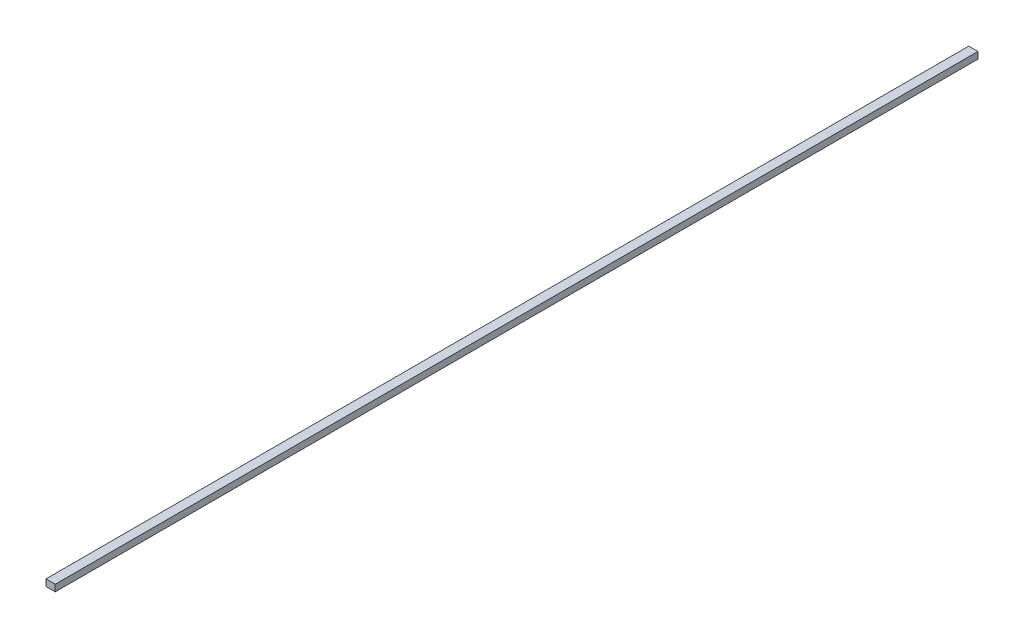
ISO-10303-21;
HEADER;
FILE_DESCRIPTION(('STEP AP214'),'2;1');
FILE_NAME('part.step','',(''),(''),'','','');
FILE_SCHEMA(('AUTOMOTIVE_DESIGN { 1 0 10303 214 1 1 1 1 }'));
ENDSEC;
DATA;
#1=APPLICATION_CONTEXT('core data for automotive mechanical design processes');
#2=APPLICATION_PROTOCOL_DEFINITION('international standard','automotive_design',2000,#1);
#3=PRODUCT_CONTEXT('',#1,'mechanical');
#4=PRODUCT('Part','Part','',(#3));
#5=PRODUCT_RELATED_PRODUCT_CATEGORY('part','',(#4));
#6=PRODUCT_DEFINITION_FORMATION('','',#4);
#7=PRODUCT_DEFINITION_CONTEXT('part definition',#1,'design');
#8=PRODUCT_DEFINITION('design','',#6,#7);
#9=PRODUCT_DEFINITION_SHAPE('','',#8);
#10=(LENGTH_UNIT() NAMED_UNIT(*) SI_UNIT(.MILLI.,.METRE.));
#11=(NAMED_UNIT(*) PLANE_ANGLE_UNIT() SI_UNIT($,.RADIAN.));
#12=(NAMED_UNIT(*) SI_UNIT($,.STERADIAN.) SOLID_ANGLE_UNIT());
#13=UNCERTAINTY_MEASURE_WITH_UNIT(LENGTH_MEASURE(1.E-05),#10,'distance_accuracy_value','');
#14=(GEOMETRIC_REPRESENTATION_CONTEXT(3) GLOBAL_UNCERTAINTY_ASSIGNED_CONTEXT((#13)) GLOBAL_UNIT_ASSIGNED_CONTEXT((#10,
#11,#12)) REPRESENTATION_CONTEXT('',''));
#15=CARTESIAN_POINT('',(0.,0.,0.));
#16=DIRECTION('',(0.,0.,1.));
#17=DIRECTION('',(1.,0.,0.));
#18=AXIS2_PLACEMENT_3D('',#15,#16,#17);
#19=CARTESIAN_POINT('',(0.,0.,500.));
#20=DIRECTION('',(1.,0.,0.));
#21=DIRECTION('',(0.,0.,-1.));
#22=AXIS2_PLACEMENT_3D('',#19,#20,#21);
#23=PLANE('',#22);
#24=DIRECTION('',(0.,-1.,0.));
#25=VECTOR('',#24,1.);
#26=CARTESIAN_POINT('',(0.,0.,0.));
#27=LINE('',#26,#25);
#28=CARTESIAN_POINT('',(0.,3.6,0.));
#29=VERTEX_POINT('',#28);
#30=CARTESIAN_POINT('',(0.,0.,0.));
#31=VERTEX_POINT('',#30);
#32=EDGE_CURVE('E98',#29,#31,#27,.T.);
#33=ORIENTED_EDGE('',*,*,#32,.T.);
#34=DIRECTION('',(0.,0.,-1.));
#35=VECTOR('',#34,1.);
#36=CARTESIAN_POINT('',(0.,0.,500.));
#37=LINE('',#36,#35);
#38=CARTESIAN_POINT('',(0.,0.,500.));
#39=VERTEX_POINT('',#38);
#40=EDGE_CURVE('E11',#39,#31,#37,.T.);
#41=ORIENTED_EDGE('',*,*,#40,.F.);
#42=DIRECTION('',(0.,-1.,0.));
#43=VECTOR('',#42,1.);
#44=CARTESIAN_POINT('',(0.,0.,500.));
#45=LINE('',#44,#43);
#46=CARTESIAN_POINT('',(0.,3.6,500.));
#47=VERTEX_POINT('',#46);
#48=EDGE_CURVE('E86',#47,#39,#45,.T.);
#49=ORIENTED_EDGE('',*,*,#48,.F.);
#50=DIRECTION('',(0.,0.,-1.));
#51=VECTOR('',#50,1.);
#52=CARTESIAN_POINT('',(0.,3.6,500.));
#53=LINE('',#52,#51);
#54=EDGE_CURVE('E94',#47,#29,#53,.T.);
#55=ORIENTED_EDGE('',*,*,#54,.T.);
#56=EDGE_LOOP('',(#33,#41,#49,#55));
#57=FACE_BOUND('',#56,.T.);
#58=ADVANCED_FACE('F35',(#57),#23,.F.);
#59=CARTESIAN_POINT('',(0.,0.,500.));
#60=DIRECTION('',(0.,1.,0.));
#61=DIRECTION('',(0.,0.,1.));
#62=AXIS2_PLACEMENT_3D('',#59,#60,#61);
#63=PLANE('',#62);
#64=DIRECTION('',(1.,0.,0.));
#65=VECTOR('',#64,1.);
#66=CARTESIAN_POINT('',(0.,0.,0.));
#67=LINE('',#66,#65);
#68=CARTESIAN_POINT('',(5.,0.,0.));
#69=VERTEX_POINT('',#68);
#70=EDGE_CURVE('E90',#31,#69,#67,.T.);
#71=ORIENTED_EDGE('',*,*,#70,.T.);
#72=DIRECTION('',(0.,0.,-1.));
#73=VECTOR('',#72,1.);
#74=CARTESIAN_POINT('',(5.,0.,500.));
#75=LINE('',#74,#73);
#76=CARTESIAN_POINT('',(5.,0.,500.));
#77=VERTEX_POINT('',#76);
#78=EDGE_CURVE('E43',#77,#69,#75,.T.);
#79=ORIENTED_EDGE('',*,*,#78,.F.);
#80=DIRECTION('',(1.,0.,0.));
#81=VECTOR('',#80,1.);
#82=CARTESIAN_POINT('',(0.,0.,500.));
#83=LINE('',#82,#81);
#84=EDGE_CURVE('E81',#39,#77,#83,.T.);
#85=ORIENTED_EDGE('',*,*,#84,.F.);
#86=ORIENTED_EDGE('',*,*,#40,.T.);
#87=EDGE_LOOP('',(#71,#79,#85,#86));
#88=FACE_BOUND('',#87,.T.);
#89=ADVANCED_FACE('F89',(#88),#63,.F.);
#90=CARTESIAN_POINT('',(5.,0.,500.));
#91=DIRECTION('',(-1.,0.,0.));
#92=DIRECTION('',(0.,0.,1.));
#93=AXIS2_PLACEMENT_3D('',#90,#91,#92);
#94=PLANE('',#93);
#95=DIRECTION('',(0.,1.,0.));
#96=VECTOR('',#95,1.);
#97=CARTESIAN_POINT('',(5.,0.,0.));
#98=LINE('',#97,#96);
#99=CARTESIAN_POINT('',(5.,3.6,0.));
#100=VERTEX_POINT('',#99);
#101=EDGE_CURVE('E68',#69,#100,#98,.T.);
#102=ORIENTED_EDGE('',*,*,#101,.T.);
#103=DIRECTION('',(0.,0.,-1.));
#104=VECTOR('',#103,1.);
#105=CARTESIAN_POINT('',(5.,3.6,500.));
#106=LINE('',#105,#104);
#107=CARTESIAN_POINT('',(5.,3.6,500.));
#108=VERTEX_POINT('',#107);
#109=EDGE_CURVE('E91',#108,#100,#106,.T.);
#110=ORIENTED_EDGE('',*,*,#109,.F.);
#111=DIRECTION('',(0.,1.,0.));
#112=VECTOR('',#111,1.);
#113=CARTESIAN_POINT('',(5.,0.,500.));
#114=LINE('',#113,#112);
#115=EDGE_CURVE('E84',#77,#108,#114,.T.);
#116=ORIENTED_EDGE('',*,*,#115,.F.);
#117=ORIENTED_EDGE('',*,*,#78,.T.);
#118=EDGE_LOOP('',(#102,#110,#116,#117));
#119=FACE_BOUND('',#118,.T.);
#120=ADVANCED_FACE('F92',(#119),#94,.F.);
#121=CARTESIAN_POINT('',(0.,3.6,500.));
#122=DIRECTION('',(0.,-1.,0.));
#123=DIRECTION('',(1.,0.,0.));
#124=AXIS2_PLACEMENT_3D('',#121,#122,#123);
#125=PLANE('',#124);
#126=DIRECTION('',(-1.,0.,0.));
#127=VECTOR('',#126,1.);
#128=CARTESIAN_POINT('',(0.,3.6,0.));
#129=LINE('',#128,#127);
#130=EDGE_CURVE('E74',#100,#29,#129,.T.);
#131=ORIENTED_EDGE('',*,*,#130,.T.);
#132=ORIENTED_EDGE('',*,*,#54,.F.);
#133=DIRECTION('',(-1.,0.,0.));
#134=VECTOR('',#133,1.);
#135=CARTESIAN_POINT('',(0.,3.6,500.));
#136=LINE('',#135,#134);
#137=EDGE_CURVE('E51',#108,#47,#136,.T.);
#138=ORIENTED_EDGE('',*,*,#137,.F.);
#139=ORIENTED_EDGE('',*,*,#109,.T.);
#140=EDGE_LOOP('',(#131,#132,#138,#139));
#141=FACE_BOUND('',#140,.T.);
#142=ADVANCED_FACE('F105',(#141),#125,.F.);
#143=CARTESIAN_POINT('',(0.,0.,500.));
#144=DIRECTION('',(0.,0.,-1.));
#145=DIRECTION('',(-1.,0.,0.));
#146=AXIS2_PLACEMENT_3D('',#143,#144,#145);
#147=PLANE('',#146);
#148=ORIENTED_EDGE('',*,*,#48,.T.);
#149=ORIENTED_EDGE('',*,*,#84,.T.);
#150=ORIENTED_EDGE('',*,*,#115,.T.);
#151=ORIENTED_EDGE('',*,*,#137,.T.);
#152=EDGE_LOOP('',(#148,#149,#150,#151));
#153=FACE_BOUND('',#152,.T.);
#154=ADVANCED_FACE('F82',(#153),#147,.F.);
#155=CARTESIAN_POINT('',(0.,0.,0.));
#156=DIRECTION('',(0.,0.,-1.));
#157=DIRECTION('',(-1.,0.,0.));
#158=AXIS2_PLACEMENT_3D('',#155,#156,#157);
#159=PLANE('',#158);
#160=ORIENTED_EDGE('',*,*,#32,.F.);
#161=ORIENTED_EDGE('',*,*,#130,.F.);
#162=ORIENTED_EDGE('',*,*,#101,.F.);
#163=ORIENTED_EDGE('',*,*,#70,.F.);
#164=EDGE_LOOP('',(#160,#161,#162,#163));
#165=FACE_BOUND('',#164,.T.);
#166=ADVANCED_FACE('F108',(#165),#159,.T.);
#167=CLOSED_SHELL('',(#58,#89,#120,#142,#154,#166));
#168=MANIFOLD_SOLID_BREP('B2',#167);
#169=ADVANCED_BREP_SHAPE_REPRESENTATION('',(#18,#168),#14);
#170=SHAPE_DEFINITION_REPRESENTATION(#9,#169);
ENDSEC;
END-ISO-10303-21;
